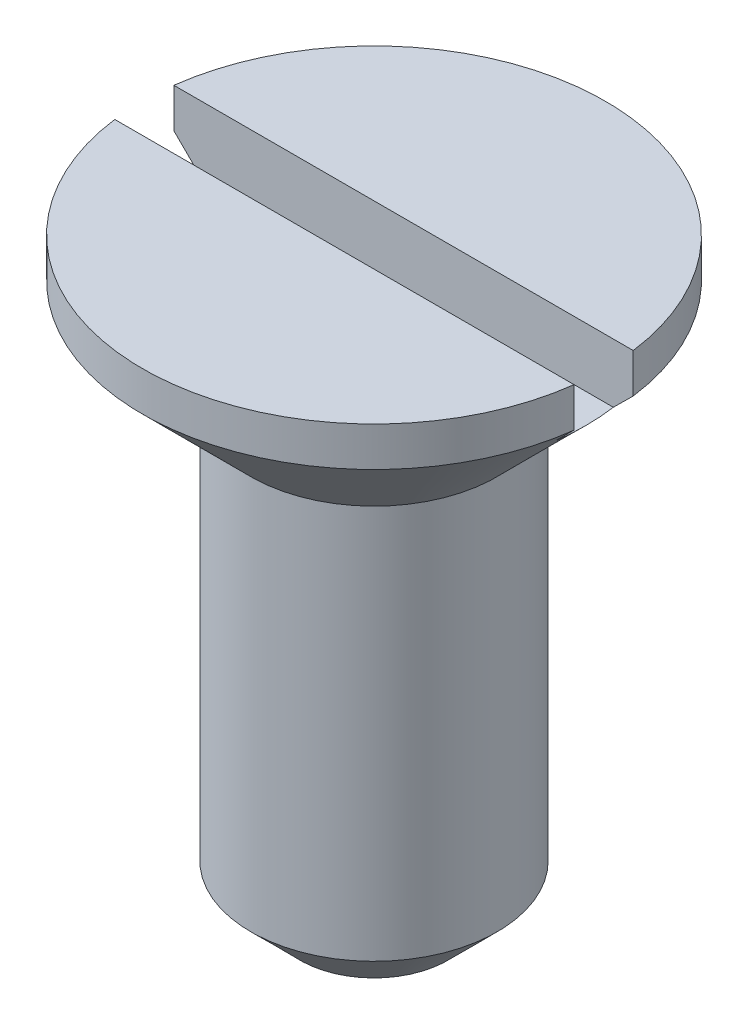
ISO-10303-21;
HEADER;
FILE_DESCRIPTION(('STEP AP214'),'2;1');
FILE_NAME('part.step','',(''),(''),'','','');
FILE_SCHEMA(('AUTOMOTIVE_DESIGN { 1 0 10303 214 1 1 1 1 }'));
ENDSEC;
DATA;
#1=APPLICATION_CONTEXT('core data for automotive mechanical design processes');
#2=APPLICATION_PROTOCOL_DEFINITION('international standard','automotive_design',2000,#1);
#3=PRODUCT_CONTEXT('',#1,'mechanical');
#4=PRODUCT('Part','Part','',(#3));
#5=PRODUCT_RELATED_PRODUCT_CATEGORY('part','',(#4));
#6=PRODUCT_DEFINITION_FORMATION('','',#4);
#7=PRODUCT_DEFINITION_CONTEXT('part definition',#1,'design');
#8=PRODUCT_DEFINITION('design','',#6,#7);
#9=PRODUCT_DEFINITION_SHAPE('','',#8);
#10=(LENGTH_UNIT() NAMED_UNIT(*) SI_UNIT(.MILLI.,.METRE.));
#11=(NAMED_UNIT(*) PLANE_ANGLE_UNIT() SI_UNIT($,.RADIAN.));
#12=(NAMED_UNIT(*) SI_UNIT($,.STERADIAN.) SOLID_ANGLE_UNIT());
#13=UNCERTAINTY_MEASURE_WITH_UNIT(LENGTH_MEASURE(1.E-05),#10,'distance_accuracy_value','');
#14=(GEOMETRIC_REPRESENTATION_CONTEXT(3) GLOBAL_UNCERTAINTY_ASSIGNED_CONTEXT((#13)) GLOBAL_UNIT_ASSIGNED_CONTEXT((#10,
#11,#12)) REPRESENTATION_CONTEXT('',''));
#15=CARTESIAN_POINT('',(0.,0.,0.));
#16=DIRECTION('',(0.,0.,1.));
#17=DIRECTION('',(1.,0.,0.));
#18=AXIS2_PLACEMENT_3D('',#15,#16,#17);
#19=CARTESIAN_POINT('',(0.,125.763182897862,0.));
#20=DIRECTION('',(0.,1.,0.));
#21=DIRECTION('',(-1.,0.,0.));
#22=AXIS2_PLACEMENT_3D('',#19,#20,#21);
#23=CYLINDRICAL_SURFACE('',#22,2.35000000000001);
#24=CARTESIAN_POINT('',(0.,91.6350422227854,0.));
#25=DIRECTION('',(0.,1.,0.));
#26=DIRECTION('',(-1.,0.,0.));
#27=AXIS2_PLACEMENT_3D('',#24,#25,#26);
#28=CIRCLE('',#27,2.35000000000001);
#29=CARTESIAN_POINT('',(2.33077240416135,91.6350422227854,-0.3));
#30=VERTEX_POINT('',#29);
#31=CARTESIAN_POINT('',(-2.33077240416135,91.6350422227854,-0.3));
#32=VERTEX_POINT('',#31);
#33=EDGE_CURVE('E103',#30,#32,#28,.T.);
#34=ORIENTED_EDGE('',*,*,#33,.T.);
#35=DIRECTION('',(0.,1.,0.));
#36=VECTOR('',#35,1.);
#37=CARTESIAN_POINT('',(-2.33077240416135,125.763182897862,-0.3));
#38=LINE('',#37,#36);
#39=CARTESIAN_POINT('',(-2.33077240416135,92.0350422227854,-0.3));
#40=VERTEX_POINT('',#39);
#41=EDGE_CURVE('E136',#32,#40,#38,.T.);
#42=ORIENTED_EDGE('',*,*,#41,.T.);
#43=CARTESIAN_POINT('',(0.,92.0350422227854,0.));
#44=DIRECTION('',(0.,1.,0.));
#45=DIRECTION('',(-1.,0.,0.));
#46=AXIS2_PLACEMENT_3D('',#43,#44,#45);
#47=CIRCLE('',#46,2.35000000000001);
#48=CARTESIAN_POINT('',(2.33077240416134,92.0350422227854,-0.3));
#49=VERTEX_POINT('',#48);
#50=EDGE_CURVE('E100',#49,#40,#47,.T.);
#51=ORIENTED_EDGE('',*,*,#50,.F.);
#52=DIRECTION('',(0.,1.,0.));
#53=VECTOR('',#52,1.);
#54=CARTESIAN_POINT('',(2.33077240416134,125.763182897862,-0.3));
#55=LINE('',#54,#53);
#56=EDGE_CURVE('E106',#49,#30,#55,.F.);
#57=ORIENTED_EDGE('',*,*,#56,.T.);
#58=EDGE_LOOP('',(#34,#42,#51,#57));
#59=FACE_BOUND('',#58,.T.);
#60=ADVANCED_FACE('F29',(#59),#23,.T.);
#61=CARTESIAN_POINT('',(0.,92.0350422227854,0.));
#62=DIRECTION('',(0.,-1.,0.));
#63=DIRECTION('',(1.,0.,0.));
#64=AXIS2_PLACEMENT_3D('',#61,#62,#63);
#65=PLANE('',#64);
#66=ORIENTED_EDGE('',*,*,#50,.T.);
#67=DIRECTION('',(1.,0.,0.));
#68=VECTOR('',#67,1.);
#69=CARTESIAN_POINT('',(0.,92.0350422227854,-0.3));
#70=LINE('',#69,#68);
#71=EDGE_CURVE('E88',#40,#49,#70,.T.);
#72=ORIENTED_EDGE('',*,*,#71,.T.);
#73=EDGE_LOOP('',(#66,#72));
#74=FACE_BOUND('',#73,.T.);
#75=ADVANCED_FACE('F162',(#74),#65,.F.);
#76=CARTESIAN_POINT('',(-2.33077240416137,91.6350422227854,0.3));
#77=VERTEX_POINT('',#76);
#78=CARTESIAN_POINT('',(2.33077240416134,91.6350422227854,0.3));
#79=VERTEX_POINT('',#78);
#80=EDGE_CURVE('E89',#77,#79,#28,.T.);
#81=ORIENTED_EDGE('',*,*,#80,.T.);
#82=DIRECTION('',(0.,1.,0.));
#83=VECTOR('',#82,1.);
#84=CARTESIAN_POINT('',(2.33077240416134,125.763182897862,0.3));
#85=LINE('',#84,#83);
#86=CARTESIAN_POINT('',(2.33077240416134,92.0350422227854,0.3));
#87=VERTEX_POINT('',#86);
#88=EDGE_CURVE('E83',#79,#87,#85,.T.);
#89=ORIENTED_EDGE('',*,*,#88,.T.);
#90=CARTESIAN_POINT('',(-2.33077240416135,92.0350422227854,0.3));
#91=VERTEX_POINT('',#90);
#92=EDGE_CURVE('E93',#91,#87,#47,.T.);
#93=ORIENTED_EDGE('',*,*,#92,.F.);
#94=DIRECTION('',(0.,1.,0.));
#95=VECTOR('',#94,1.);
#96=CARTESIAN_POINT('',(-2.33077240416135,125.763182897862,0.3));
#97=LINE('',#96,#95);
#98=EDGE_CURVE('E44',#91,#77,#97,.F.);
#99=ORIENTED_EDGE('',*,*,#98,.T.);
#100=EDGE_LOOP('',(#81,#89,#93,#99));
#101=FACE_BOUND('',#100,.T.);
#102=ADVANCED_FACE('F31',(#101),#23,.T.);
#103=CARTESIAN_POINT('',(0.,90.5350422227853,0.));
#104=DIRECTION('',(0.,1.,0.));
#105=DIRECTION('',(-1.,0.,0.));
#106=AXIS2_PLACEMENT_3D('',#103,#104,#105);
#107=CONICAL_SURFACE('',#106,1.25000000000001,0.78539816339744);
#108=ORIENTED_EDGE('',*,*,#33,.F.);
#109=CARTESIAN_POINT('',(5.16404527801653,94.4577942595068,-0.300000000000001));
#110=CARTESIAN_POINT('',(4.98854511223444,94.2825918100933,-0.300000000000001));
#111=CARTESIAN_POINT('',(4.81303209254194,94.1074022269505,-0.300000000000001));
#112=CARTESIAN_POINT('',(4.46196190687898,93.7570629773925,-0.300000000000001));
#113=CARTESIAN_POINT('',(4.28640474039153,93.5819133114954,-0.3));
#114=CARTESIAN_POINT('',(3.93518385937766,93.2316242396878,-0.3));
#115=CARTESIAN_POINT('',(3.75952012882712,93.0564848498436,-0.3));
#116=CARTESIAN_POINT('',(3.40810721702201,92.7062960142403,-0.3));
#117=CARTESIAN_POINT('',(3.23235803681931,92.5312465674262,-0.3));
#118=CARTESIAN_POINT('',(2.87435321817219,92.1749540785795,-0.3));
#119=CARTESIAN_POINT('',(2.69209238748873,91.9937162543734,-0.3));
#120=CARTESIAN_POINT('',(2.32730280190239,91.6314970781393,-0.3));
#121=CARTESIAN_POINT('',(2.14477403769177,91.4505157354719,-0.3));
#122=CARTESIAN_POINT('',(1.87058192238538,91.1794796613824,-0.3));
#123=CARTESIAN_POINT('',(1.77912617438861,91.0892149361461,-0.3));
#124=CARTESIAN_POINT('',(1.59599412728,90.9089064185774,-0.3));
#125=CARTESIAN_POINT('',(1.50431782498118,90.8188626294758,-0.3));
#126=CARTESIAN_POINT('',(1.32060275611906,90.6391581535455,-0.3));
#127=CARTESIAN_POINT('',(1.22856401400163,90.5494974417014,-0.3));
#128=CARTESIAN_POINT('',(1.04382868301958,90.3708568965919,-0.3));
#129=CARTESIAN_POINT('',(0.951132115503265,90.2818770414237,-0.3));
#130=CARTESIAN_POINT('',(0.832576740840209,90.1699830439514,-0.3));
#131=CARTESIAN_POINT('',(0.80740932019611,90.1463374785841,-0.3));
#132=CARTESIAN_POINT('',(0.756927871802552,90.0992023825941,-0.3));
#133=CARTESIAN_POINT('',(0.73161384174161,90.0757128544442,-0.3));
#134=CARTESIAN_POINT('',(0.680886100047081,90.0290233704677,-0.3));
#135=CARTESIAN_POINT('',(0.655473063997355,90.0058226815053,-0.3));
#136=CARTESIAN_POINT('',(0.604392130207132,89.9597044563383,-0.3));
#137=CARTESIAN_POINT('',(0.578724241581384,89.9367869100726,-0.3));
#138=CARTESIAN_POINT('',(0.518267314064062,89.8836463384501,-0.3));
#139=CARTESIAN_POINT('',(0.483338135350432,89.8535826007896,-0.3));
#140=CARTESIAN_POINT('',(0.412218933886534,89.7944732295331,-0.3));
#141=CARTESIAN_POINT('',(0.37602219143765,89.7654354837544,-0.3));
#142=CARTESIAN_POINT('',(0.320072853564388,89.723557135404,-0.3));
#143=CARTESIAN_POINT('',(0.301017234201496,89.7097930449218,-0.3));
#144=CARTESIAN_POINT('',(0.262201945072,89.6832226481294,-0.3));
#145=CARTESIAN_POINT('',(0.242441361156993,89.6704176574879,-0.3));
#146=CARTESIAN_POINT('',(0.202182687483561,89.6464535923814,-0.3));
#147=CARTESIAN_POINT('',(0.181693479987392,89.6352799209678,-0.3));
#148=CARTESIAN_POINT('',(0.139575845156788,89.615402769764,-0.3));
#149=CARTESIAN_POINT('',(0.117951263901656,89.6066915172165,-0.3));
#150=CARTESIAN_POINT('',(0.0753539742140014,89.5937601252347,-0.3));
#151=CARTESIAN_POINT('',(0.0544855635375993,89.589217765969,-0.3));
#152=CARTESIAN_POINT('',(0.0123288497489169,89.5845753045623,-0.3));
#153=CARTESIAN_POINT('',(-0.00895663738570029,89.5844517562171,-0.3));
#154=CARTESIAN_POINT('',(-0.0509505716715608,89.5886160271065,-0.3));
#155=CARTESIAN_POINT('',(-0.0716612534321067,89.5928832007483,-0.3));
#156=CARTESIAN_POINT('',(-0.112203509888114,89.6047410259793,-0.3));
#157=CARTESIAN_POINT('',(-0.132027669143872,89.6123554192701,-0.3));
#158=CARTESIAN_POINT('',(-0.168572292117349,89.6288153636184,-0.3));
#159=CARTESIAN_POINT('',(-0.18539678330741,89.637439275416,-0.3));
#160=CARTESIAN_POINT('',(-0.218395128215774,89.6558656820368,-0.3));
#161=CARTESIAN_POINT('',(-0.234568426270372,89.6656691560804,-0.3));
#162=CARTESIAN_POINT('',(-0.282431976832135,89.6963307294459,-0.3));
#163=CARTESIAN_POINT('',(-0.313348905503003,89.7183804585735,-0.3));
#164=CARTESIAN_POINT('',(-0.374243746859645,89.764273868577,-0.3));
#165=CARTESIAN_POINT('',(-0.404209782728267,89.7881327508726,-0.3));
#166=CARTESIAN_POINT('',(-0.463297029753755,89.8367351115389,-0.3));
#167=CARTESIAN_POINT('',(-0.492420036343984,89.8614764138399,-0.3));
#168=CARTESIAN_POINT('',(-0.577829838417129,89.9354868250557,-0.3));
#169=CARTESIAN_POINT('',(-0.63341983372646,89.9855535563165,-0.3));
#170=CARTESIAN_POINT('',(-0.743695771288837,90.0866784841683,-0.3));
#171=CARTESIAN_POINT('',(-0.798381553821792,90.1377368525303,-0.3));
#172=CARTESIAN_POINT('',(-0.907291284144754,90.2404736469155,-0.3));
#173=CARTESIAN_POINT('',(-0.961514600478778,90.2921527422307,-0.3));
#174=CARTESIAN_POINT('',(-1.06963184533792,90.3958447996387,-0.3));
#175=CARTESIAN_POINT('',(-1.12352579925614,90.4478577353429,-0.3));
#176=CARTESIAN_POINT('',(-1.28379950959898,90.6031606215175,-0.3));
#177=CARTESIAN_POINT('',(-1.389873511675,90.7067659002829,-0.3));
#178=CARTESIAN_POINT('',(-1.6015671794023,90.9143376194787,-0.3));
#179=CARTESIAN_POINT('',(-1.70718703736464,91.0183038644165,-0.3));
#180=CARTESIAN_POINT('',(-1.95163773521721,91.2594706229836,-0.3));
#181=CARTESIAN_POINT('',(-2.09038238021644,91.3967585075871,-0.3));
#182=CARTESIAN_POINT('',(-2.3676524400355,91.6715560853429,-0.3));
#183=CARTESIAN_POINT('',(-2.50617785416583,91.8090657791902,-0.3));
#184=CARTESIAN_POINT('',(-2.92161530315839,92.2218492697184,-0.3));
#185=CARTESIAN_POINT('',(-3.19833106315813,92.497320577905,-0.3));
#186=CARTESIAN_POINT('',(-3.7566526692704,93.0535804002712,-0.299999999999999));
#187=CARTESIAN_POINT('',(-4.03825436110317,93.3343730802681,-0.299999999999999));
#188=CARTESIAN_POINT('',(-4.60125960589021,93.8960347747106,-0.299999999999999));
#189=CARTESIAN_POINT('',(-4.88266318859484,94.1769037593315,-0.299999999999999));
#190=CARTESIAN_POINT('',(-5.16404527801654,94.4577942595068,-0.299999999999999));
#191=B_SPLINE_CURVE_WITH_KNOTS('',3,(#109,#110,#111,#112,#113,#114,#115,#116,#117,#118,#119,
#120,#121,#122,#123,#124,#125,#126,#127,#128,#129,#130,#131,#132,#133,#134,#135,#136,#137,#138,
#139,#140,#141,#142,#143,#144,#145,#146,#147,#148,#149,#150,#151,#152,#153,#154,#155,#156,#157,
#158,#159,#160,#161,#162,#163,#164,#165,#166,#167,#168,#169,#170,#171,#172,#173,#174,#175,#176,
#177,#178,#179,#180,#181,#182,#183,#184,#185,#186,#187,#188,#189,#190),.UNSPECIFIED.,.F.,.F.,(4,
2,2,2,2,2,2,2,2,2,2,2,2,2,2,2,2,2,2,2,2,2,2,2,2,2,2,2,2,2,2,2,2,2,2,2,2,2,2,2,4),(0.,
0.743952870352604,1.48791490152677,2.23208151542594,2.97623918951504,3.74733929563194,
4.51846685478597,4.90396234779834,5.28946344501005,5.67493897165383,6.06040204521683,
6.1639998346229,6.26759926185074,6.37082991302827,6.47405688538718,6.61230458709904,
6.75145089376193,6.82195212826494,6.89254836759327,6.96246807984051,7.03216455728613,
7.09585752678059,7.15921249105329,7.22227090958056,7.2857840034851,7.34244077690177,
7.39914491306138,7.51294472887576,7.62783798502715,7.74246522116445,7.96687196692445,
8.19131793729743,8.41603267760221,8.64072986863137,9.08555454863163,9.53016739044899,
10.1157283286829,10.7012911048978,11.8726592944064,13.0656791429272,14.2584398773779),.UNSPECIFIED.);
#192=CARTESIAN_POINT('',(2.12896688560437,91.4350422227854,-0.3));
#193=VERTEX_POINT('',#192);
#194=EDGE_CURVE('E52',#30,#193,#191,.T.);
#195=ORIENTED_EDGE('',*,*,#194,.T.);
#196=CARTESIAN_POINT('',(0.,91.4350422227854,0.));
#197=DIRECTION('',(0.,1.,0.));
#198=DIRECTION('',(0.,0.,1.));
#199=AXIS2_PLACEMENT_3D('',#196,#197,#198);
#200=CIRCLE('',#199,2.14999999999999);
#201=CARTESIAN_POINT('',(2.12896688560437,91.4350422227854,0.3));
#202=VERTEX_POINT('',#201);
#203=EDGE_CURVE('E115',#202,#193,#200,.T.);
#204=ORIENTED_EDGE('',*,*,#203,.F.);
#205=CARTESIAN_POINT('',(-5.16404527801654,94.4577942595068,0.300000000000001));
#206=CARTESIAN_POINT('',(-4.98854511223445,94.2825918100933,0.300000000000001));
#207=CARTESIAN_POINT('',(-4.81303209254195,94.1074022269505,0.3));
#208=CARTESIAN_POINT('',(-4.461961906879,93.7570629773925,0.3));
#209=CARTESIAN_POINT('',(-4.28640474039155,93.5819133114954,0.3));
#210=CARTESIAN_POINT('',(-3.93518385937767,93.2316242396878,0.3));
#211=CARTESIAN_POINT('',(-3.75952012882713,93.0564848498436,0.3));
#212=CARTESIAN_POINT('',(-3.40810721702201,92.7062960142403,0.3));
#213=CARTESIAN_POINT('',(-3.23235803681932,92.5312465674262,0.3));
#214=CARTESIAN_POINT('',(-2.8743532181722,92.1749540785795,0.3));
#215=CARTESIAN_POINT('',(-2.69209238748875,91.9937162543734,0.3));
#216=CARTESIAN_POINT('',(-2.3273028019024,91.6314970781393,0.3));
#217=CARTESIAN_POINT('',(-2.14477403769178,91.4505157354719,0.3));
#218=CARTESIAN_POINT('',(-1.87058192238539,91.1794796613824,0.3));
#219=CARTESIAN_POINT('',(-1.77912617438863,91.0892149361461,0.3));
#220=CARTESIAN_POINT('',(-1.59599412728002,90.9089064185774,0.3));
#221=CARTESIAN_POINT('',(-1.50431782498121,90.8188626294758,0.3));
#222=CARTESIAN_POINT('',(-1.32060275611909,90.6391581535455,0.3));
#223=CARTESIAN_POINT('',(-1.22856401400165,90.5494974417014,0.3));
#224=CARTESIAN_POINT('',(-1.0438286830196,90.3708568965919,0.3));
#225=CARTESIAN_POINT('',(-0.951132115503285,90.2818770414237,0.3));
#226=CARTESIAN_POINT('',(-0.832576740840223,90.1699830439514,0.3));
#227=CARTESIAN_POINT('',(-0.807409320196124,90.1463374785841,0.3));
#228=CARTESIAN_POINT('',(-0.756927871802566,90.0992023825941,0.3));
#229=CARTESIAN_POINT('',(-0.731613841741623,90.0757128544442,0.3));
#230=CARTESIAN_POINT('',(-0.680886100047096,90.0290233704677,0.3));
#231=CARTESIAN_POINT('',(-0.655473063997374,90.0058226815053,0.3));
#232=CARTESIAN_POINT('',(-0.60439213020715,89.9597044563383,0.3));
#233=CARTESIAN_POINT('',(-0.578724241581398,89.9367869100726,0.3));
#234=CARTESIAN_POINT('',(-0.518267314064073,89.8836463384501,0.3));
#235=CARTESIAN_POINT('',(-0.483338135350445,89.8535826007896,0.3));
#236=CARTESIAN_POINT('',(-0.412218933886546,89.7944732295331,0.3));
#237=CARTESIAN_POINT('',(-0.376022191437658,89.7654354837544,0.3));
#238=CARTESIAN_POINT('',(-0.320072853564405,89.7235571354041,0.3));
#239=CARTESIAN_POINT('',(-0.301017234201519,89.7097930449218,0.3));
#240=CARTESIAN_POINT('',(-0.262201945072023,89.6832226481294,0.3));
#241=CARTESIAN_POINT('',(-0.24244136115701,89.6704176574879,0.3));
#242=CARTESIAN_POINT('',(-0.202182687483573,89.6464535923814,0.3));
#243=CARTESIAN_POINT('',(-0.181693479987405,89.6352799209678,0.3));
#244=CARTESIAN_POINT('',(-0.139575845156801,89.6154027697639,0.3));
#245=CARTESIAN_POINT('',(-0.117951263901669,89.6066915172165,0.3));
#246=CARTESIAN_POINT('',(-0.0753539742140143,89.5937601252347,0.3));
#247=CARTESIAN_POINT('',(-0.054485563537612,89.589217765969,0.3));
#248=CARTESIAN_POINT('',(-0.0123288497489295,89.5845753045623,0.3));
#249=CARTESIAN_POINT('',(0.00895663738568733,89.5844517562171,0.3));
#250=CARTESIAN_POINT('',(0.0509505716715478,89.5886160271065,0.3));
#251=CARTESIAN_POINT('',(0.071661253432094,89.5928832007483,0.3));
#252=CARTESIAN_POINT('',(0.112203509888101,89.6047410259793,0.3));
#253=CARTESIAN_POINT('',(0.13202766914386,89.6123554192701,0.3));
#254=CARTESIAN_POINT('',(0.168572292117336,89.6288153636184,0.3));
#255=CARTESIAN_POINT('',(0.185396783307397,89.637439275416,0.3));
#256=CARTESIAN_POINT('',(0.218395128215761,89.6558656820368,0.3));
#257=CARTESIAN_POINT('',(0.234568426270359,89.6656691560804,0.3));
#258=CARTESIAN_POINT('',(0.282431976832122,89.6963307294459,0.3));
#259=CARTESIAN_POINT('',(0.313348905502991,89.7183804585735,0.3));
#260=CARTESIAN_POINT('',(0.374243746859633,89.764273868577,0.3));
#261=CARTESIAN_POINT('',(0.404209782728255,89.7881327508726,0.3));
#262=CARTESIAN_POINT('',(0.463297029753745,89.8367351115389,0.3));
#263=CARTESIAN_POINT('',(0.492420036343975,89.8614764138399,0.3));
#264=CARTESIAN_POINT('',(0.577829838417121,89.9354868250557,0.3));
#265=CARTESIAN_POINT('',(0.63341983372645,89.9855535563165,0.3));
#266=CARTESIAN_POINT('',(0.743695771288825,90.0866784841683,0.3));
#267=CARTESIAN_POINT('',(0.79838155382178,90.1377368525303,0.3));
#268=CARTESIAN_POINT('',(0.907291284144743,90.2404736469155,0.3));
#269=CARTESIAN_POINT('',(0.961514600478768,90.2921527422307,0.3));
#270=CARTESIAN_POINT('',(1.06963184533791,90.3958447996387,0.3));
#271=CARTESIAN_POINT('',(1.12352579925613,90.4478577353429,0.3));
#272=CARTESIAN_POINT('',(1.28379950959898,90.6031606215175,0.3));
#273=CARTESIAN_POINT('',(1.389873511675,90.7067659002829,0.3));
#274=CARTESIAN_POINT('',(1.6015671794023,90.9143376194787,0.3));
#275=CARTESIAN_POINT('',(1.70718703736464,91.0183038644165,0.3));
#276=CARTESIAN_POINT('',(1.95163773521722,91.2594706229836,0.3));
#277=CARTESIAN_POINT('',(2.09038238021645,91.3967585075871,0.3));
#278=CARTESIAN_POINT('',(2.36765244003551,91.6715560853429,0.3));
#279=CARTESIAN_POINT('',(2.50617785416584,91.8090657791902,0.3));
#280=CARTESIAN_POINT('',(2.9216153031584,92.2218492697184,0.3));
#281=CARTESIAN_POINT('',(3.19833106315814,92.4973205779051,0.3));
#282=CARTESIAN_POINT('',(3.75665266927041,93.0535804002712,0.3));
#283=CARTESIAN_POINT('',(4.03825436110317,93.3343730802681,0.3));
#284=CARTESIAN_POINT('',(4.60125960589021,93.8960347747107,0.299999999999999));
#285=CARTESIAN_POINT('',(4.88266318859482,94.1769037593315,0.299999999999999));
#286=CARTESIAN_POINT('',(5.16404527801653,94.4577942595068,0.299999999999999));
#287=B_SPLINE_CURVE_WITH_KNOTS('',3,(#205,#206,#207,#208,#209,#210,#211,#212,#213,#214,#215,
#216,#217,#218,#219,#220,#221,#222,#223,#224,#225,#226,#227,#228,#229,#230,#231,#232,#233,#234,
#235,#236,#237,#238,#239,#240,#241,#242,#243,#244,#245,#246,#247,#248,#249,#250,#251,#252,#253,
#254,#255,#256,#257,#258,#259,#260,#261,#262,#263,#264,#265,#266,#267,#268,#269,#270,#271,#272,
#273,#274,#275,#276,#277,#278,#279,#280,#281,#282,#283,#284,#285,#286),.UNSPECIFIED.,.F.,.F.,(4,
2,2,2,2,2,2,2,2,2,2,2,2,2,2,2,2,2,2,2,2,2,2,2,2,2,2,2,2,2,2,2,2,2,2,2,2,2,2,2,4),(0.,
0.743952870352604,1.48791490152676,2.23208151542596,2.97623918951504,3.74733929563194,
4.51846685478597,4.90396234779833,5.28946344501003,5.67493897165379,6.06040204521683,
6.1639998346229,6.26759926185074,6.37082991302826,6.47405688538718,6.61230458709905,
6.75145089376193,6.82195212826493,6.89254836759327,6.96246807984051,7.03216455728613,
7.09585752678059,7.15921249105329,7.22227090958056,7.2857840034851,7.34244077690177,
7.39914491306139,7.51294472887576,7.62783798502715,7.74246522116446,7.96687196692446,
8.19131793729743,8.41603267760222,8.64072986863139,9.08555454863165,9.53016739044901,
10.1157283286829,10.7012911048978,11.8726592944065,13.0656791429272,14.2584398773779),.UNSPECIFIED.);
#288=EDGE_CURVE('E96',#202,#79,#287,.T.);
#289=ORIENTED_EDGE('',*,*,#288,.T.);
#290=ORIENTED_EDGE('',*,*,#80,.F.);
#291=CARTESIAN_POINT('',(-2.12896688560438,91.4350422227854,0.3));
#292=VERTEX_POINT('',#291);
#293=EDGE_CURVE('E95',#77,#292,#287,.T.);
#294=ORIENTED_EDGE('',*,*,#293,.T.);
#295=CARTESIAN_POINT('',(-2.12896688560438,91.4350422227854,-0.3));
#296=VERTEX_POINT('',#295);
#297=EDGE_CURVE('E114',#296,#292,#200,.T.);
#298=ORIENTED_EDGE('',*,*,#297,.F.);
#299=EDGE_CURVE('E131',#296,#32,#191,.T.);
#300=ORIENTED_EDGE('',*,*,#299,.T.);
#301=EDGE_LOOP('',(#108,#195,#204,#289,#290,#294,#298,#300));
#302=FACE_BOUND('',#301,.T.);
#303=CARTESIAN_POINT('',(0.,90.5350422227853,0.));
#304=DIRECTION('',(0.,1.,0.));
#305=DIRECTION('',(-1.,0.,0.));
#306=AXIS2_PLACEMENT_3D('',#303,#304,#305);
#307=CIRCLE('',#306,1.25000000000001);
#308=CARTESIAN_POINT('',(-1.25000000000002,90.5350422227853,0.));
#309=VERTEX_POINT('',#308);
#310=EDGE_CURVE('E99',#309,#309,#307,.T.);
#311=ORIENTED_EDGE('',*,*,#310,.T.);
#312=EDGE_LOOP('',(#311));
#313=FACE_BOUND('',#312,.T.);
#314=ADVANCED_FACE('F134',(#302,#313),#107,.T.);
#315=CARTESIAN_POINT('',(0.,125.763182897862,0.));
#316=DIRECTION('',(0.,1.,0.));
#317=DIRECTION('',(-1.,0.,0.));
#318=AXIS2_PLACEMENT_3D('',#315,#316,#317);
#319=CYLINDRICAL_SURFACE('',#318,1.25000000000001);
#320=CARTESIAN_POINT('',(0.,86.5350422227853,0.));
#321=DIRECTION('',(0.,1.,0.));
#322=DIRECTION('',(-1.,0.,0.));
#323=AXIS2_PLACEMENT_3D('',#320,#321,#322);
#324=CIRCLE('',#323,1.25000000000001);
#325=CARTESIAN_POINT('',(-1.25000000000002,86.5350422227853,0.));
#326=VERTEX_POINT('',#325);
#327=EDGE_CURVE('E37',#326,#326,#324,.T.);
#328=ORIENTED_EDGE('',*,*,#327,.T.);
#329=EDGE_LOOP('',(#328));
#330=FACE_BOUND('',#329,.T.);
#331=ORIENTED_EDGE('',*,*,#310,.F.);
#332=EDGE_LOOP('',(#331));
#333=FACE_BOUND('',#332,.T.);
#334=ADVANCED_FACE('F164',(#330,#333),#319,.T.);
#335=CARTESIAN_POINT('',(1.25,86.0350422227853,0.));
#336=DIRECTION('',(0.,1.,0.));
#337=DIRECTION('',(-1.,0.,0.));
#338=AXIS2_PLACEMENT_3D('',#335,#336,#337);
#339=PLANE('',#338);
#340=CARTESIAN_POINT('',(0.,86.0350422227853,0.));
#341=DIRECTION('',(0.,1.,0.));
#342=DIRECTION('',(-1.,0.,0.));
#343=AXIS2_PLACEMENT_3D('',#340,#341,#342);
#344=CIRCLE('',#343,0.750000000000007);
#345=CARTESIAN_POINT('',(-0.750000000000013,86.0350422227853,0.));
#346=VERTEX_POINT('',#345);
#347=EDGE_CURVE('E11',#346,#346,#344,.F.);
#348=ORIENTED_EDGE('',*,*,#347,.T.);
#349=EDGE_LOOP('',(#348));
#350=FACE_BOUND('',#349,.T.);
#351=ADVANCED_FACE('F161',(#350),#339,.F.);
#352=ORIENTED_EDGE('',*,*,#92,.T.);
#353=DIRECTION('',(-1.,0.,0.));
#354=VECTOR('',#353,1.);
#355=CARTESIAN_POINT('',(0.,92.0350422227854,0.3));
#356=LINE('',#355,#354);
#357=EDGE_CURVE('E80',#87,#91,#356,.T.);
#358=ORIENTED_EDGE('',*,*,#357,.T.);
#359=EDGE_LOOP('',(#352,#358));
#360=FACE_BOUND('',#359,.T.);
#361=ADVANCED_FACE('F98',(#360),#65,.F.);
#362=CARTESIAN_POINT('',(-2.35000000000001,91.4350422227854,0.3));
#363=DIRECTION('',(0.,1.,0.));
#364=DIRECTION('',(0.,0.,1.));
#365=AXIS2_PLACEMENT_3D('',#362,#363,#364);
#366=PLANE('',#365);
#367=ORIENTED_EDGE('',*,*,#203,.T.);
#368=DIRECTION('',(-1.,0.,0.));
#369=VECTOR('',#368,1.);
#370=CARTESIAN_POINT('',(-2.35000000000001,91.4350422227854,-0.3));
#371=LINE('',#370,#369);
#372=EDGE_CURVE('E124',#193,#296,#371,.T.);
#373=ORIENTED_EDGE('',*,*,#372,.T.);
#374=ORIENTED_EDGE('',*,*,#297,.T.);
#375=DIRECTION('',(1.,0.,0.));
#376=VECTOR('',#375,1.);
#377=CARTESIAN_POINT('',(-2.35000000000001,91.4350422227854,0.3));
#378=LINE('',#377,#376);
#379=EDGE_CURVE('E127',#292,#202,#378,.T.);
#380=ORIENTED_EDGE('',*,*,#379,.T.);
#381=EDGE_LOOP('',(#367,#373,#374,#380));
#382=FACE_BOUND('',#381,.T.);
#383=ADVANCED_FACE('F123',(#382),#366,.T.);
#384=CARTESIAN_POINT('',(-2.35000000000001,91.4350422227854,-0.3));
#385=DIRECTION('',(0.,0.,-1.));
#386=DIRECTION('',(-1.,0.,0.));
#387=AXIS2_PLACEMENT_3D('',#384,#385,#386);
#388=PLANE('',#387);
#389=ORIENTED_EDGE('',*,*,#71,.F.);
#390=ORIENTED_EDGE('',*,*,#41,.F.);
#391=ORIENTED_EDGE('',*,*,#299,.F.);
#392=ORIENTED_EDGE('',*,*,#372,.F.);
#393=ORIENTED_EDGE('',*,*,#194,.F.);
#394=ORIENTED_EDGE('',*,*,#56,.F.);
#395=EDGE_LOOP('',(#389,#390,#391,#392,#393,#394));
#396=FACE_BOUND('',#395,.T.);
#397=ADVANCED_FACE('F129',(#396),#388,.F.);
#398=CARTESIAN_POINT('',(-2.35000000000001,91.4350422227854,0.3));
#399=DIRECTION('',(0.,0.,1.));
#400=DIRECTION('',(1.,0.,0.));
#401=AXIS2_PLACEMENT_3D('',#398,#399,#400);
#402=PLANE('',#401);
#403=ORIENTED_EDGE('',*,*,#357,.F.);
#404=ORIENTED_EDGE('',*,*,#88,.F.);
#405=ORIENTED_EDGE('',*,*,#288,.F.);
#406=ORIENTED_EDGE('',*,*,#379,.F.);
#407=ORIENTED_EDGE('',*,*,#293,.F.);
#408=ORIENTED_EDGE('',*,*,#98,.F.);
#409=EDGE_LOOP('',(#403,#404,#405,#406,#407,#408));
#410=FACE_BOUND('',#409,.T.);
#411=ADVANCED_FACE('F82',(#410),#402,.F.);
#412=CARTESIAN_POINT('',(0.,86.5350422227853,0.));
#413=DIRECTION('',(0.,1.,0.));
#414=DIRECTION('',(-1.,0.,0.));
#415=AXIS2_PLACEMENT_3D('',#412,#413,#414);
#416=CONICAL_SURFACE('',#415,1.25000000000001,0.785398163397452);
#417=ORIENTED_EDGE('',*,*,#347,.F.);
#418=EDGE_LOOP('',(#417));
#419=FACE_BOUND('',#418,.T.);
#420=ORIENTED_EDGE('',*,*,#327,.F.);
#421=EDGE_LOOP('',(#420));
#422=FACE_BOUND('',#421,.T.);
#423=ADVANCED_FACE('F156',(#419,#422),#416,.T.);
#424=CLOSED_SHELL('',(#60,#75,#102,#314,#334,#351,#361,#383,#397,#411,#423));
#425=MANIFOLD_SOLID_BREP('B2',#424);
#426=ADVANCED_BREP_SHAPE_REPRESENTATION('',(#18,#425),#14);
#427=SHAPE_DEFINITION_REPRESENTATION(#9,#426);
ENDSEC;
END-ISO-10303-21;
